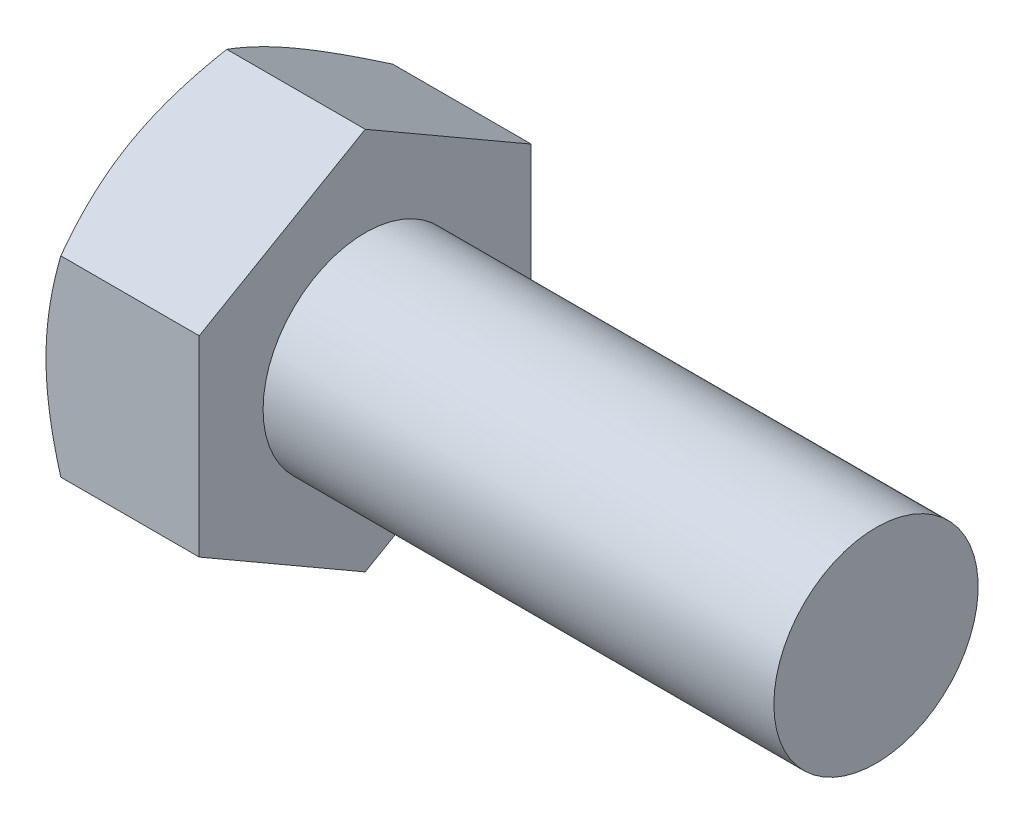
ISO-10303-21;
HEADER;
FILE_DESCRIPTION(('STEP AP214'),'2;1');
FILE_NAME('part.step','',(''),(''),'','','');
FILE_SCHEMA(('AUTOMOTIVE_DESIGN { 1 0 10303 214 1 1 1 1 }'));
ENDSEC;
DATA;
#1=APPLICATION_CONTEXT('core data for automotive mechanical design processes');
#2=APPLICATION_PROTOCOL_DEFINITION('international standard','automotive_design',2000,#1);
#3=PRODUCT_CONTEXT('',#1,'mechanical');
#4=PRODUCT('Part','Part','',(#3));
#5=PRODUCT_RELATED_PRODUCT_CATEGORY('part','',(#4));
#6=PRODUCT_DEFINITION_FORMATION('','',#4);
#7=PRODUCT_DEFINITION_CONTEXT('part definition',#1,'design');
#8=PRODUCT_DEFINITION('design','',#6,#7);
#9=PRODUCT_DEFINITION_SHAPE('','',#8);
#10=(LENGTH_UNIT() NAMED_UNIT(*) SI_UNIT(.MILLI.,.METRE.));
#11=(NAMED_UNIT(*) PLANE_ANGLE_UNIT() SI_UNIT($,.RADIAN.));
#12=(NAMED_UNIT(*) SI_UNIT($,.STERADIAN.) SOLID_ANGLE_UNIT());
#13=UNCERTAINTY_MEASURE_WITH_UNIT(LENGTH_MEASURE(1.E-05),#10,'distance_accuracy_value','');
#14=(GEOMETRIC_REPRESENTATION_CONTEXT(3) GLOBAL_UNCERTAINTY_ASSIGNED_CONTEXT((#13)) GLOBAL_UNIT_ASSIGNED_CONTEXT((#10,
#11,#12)) REPRESENTATION_CONTEXT('',''));
#15=CARTESIAN_POINT('',(0.,0.,0.));
#16=DIRECTION('',(0.,0.,1.));
#17=DIRECTION('',(1.,0.,0.));
#18=AXIS2_PLACEMENT_3D('',#15,#16,#17);
#19=CARTESIAN_POINT('',(6.,4.,0.));
#20=DIRECTION('',(-1.,0.,0.));
#21=DIRECTION('',(0.,0.,1.));
#22=AXIS2_PLACEMENT_3D('',#19,#20,#21);
#23=PLANE('',#22);
#24=CARTESIAN_POINT('',(6.,0.,0.));
#25=DIRECTION('',(-1.,0.,0.));
#26=DIRECTION('',(0.,0.,1.));
#27=AXIS2_PLACEMENT_3D('',#24,#25,#26);
#28=CIRCLE('',#27,4.);
#29=CARTESIAN_POINT('',(6.,0.,4.));
#30=VERTEX_POINT('',#29);
#31=EDGE_CURVE('E192',#30,#30,#28,.T.);
#32=ORIENTED_EDGE('',*,*,#31,.T.);
#33=EDGE_LOOP('',(#32));
#34=FACE_BOUND('',#33,.T.);
#35=DIRECTION('',(0.,1.,0.));
#36=VECTOR('',#35,1.);
#37=CARTESIAN_POINT('',(6.,-3.75277676613167,6.5));
#38=LINE('',#37,#36);
#39=CARTESIAN_POINT('',(6.,-3.75277676613167,6.5));
#40=VERTEX_POINT('',#39);
#41=CARTESIAN_POINT('',(6.,3.75277676613193,6.5));
#42=VERTEX_POINT('',#41);
#43=EDGE_CURVE('E56',#40,#42,#38,.T.);
#44=ORIENTED_EDGE('',*,*,#43,.F.);
#45=DIRECTION('',(0.,0.50000000163871,0.866025402838329));
#46=VECTOR('',#45,1.);
#47=CARTESIAN_POINT('',(6.,-7.50555353226347,0.));
#48=LINE('',#47,#46);
#49=CARTESIAN_POINT('',(6.,-7.50555353226347,0.));
#50=VERTEX_POINT('',#49);
#51=EDGE_CURVE('E129',#50,#40,#48,.T.);
#52=ORIENTED_EDGE('',*,*,#51,.F.);
#53=DIRECTION('',(0.,-0.50000000163871,0.866025402838329));
#54=VECTOR('',#53,1.);
#55=CARTESIAN_POINT('',(6.,-3.75277676613167,-6.5));
#56=LINE('',#55,#54);
#57=CARTESIAN_POINT('',(6.,-3.75277676613167,-6.5));
#58=VERTEX_POINT('',#57);
#59=EDGE_CURVE('E127',#58,#50,#56,.T.);
#60=ORIENTED_EDGE('',*,*,#59,.F.);
#61=DIRECTION('',(0.,-1.,0.));
#62=VECTOR('',#61,1.);
#63=CARTESIAN_POINT('',(6.,3.75277676613193,-6.5));
#64=LINE('',#63,#62);
#65=CARTESIAN_POINT('',(6.,3.75277676613193,-6.5));
#66=VERTEX_POINT('',#65);
#67=EDGE_CURVE('E110',#66,#58,#64,.T.);
#68=ORIENTED_EDGE('',*,*,#67,.F.);
#69=DIRECTION('',(0.,-0.50000000163871,-0.866025402838329));
#70=VECTOR('',#69,1.);
#71=CARTESIAN_POINT('',(6.,7.50555353226373,0.));
#72=LINE('',#71,#70);
#73=CARTESIAN_POINT('',(6.,7.50555353226373,0.));
#74=VERTEX_POINT('',#73);
#75=EDGE_CURVE('E119',#74,#66,#72,.T.);
#76=ORIENTED_EDGE('',*,*,#75,.F.);
#77=DIRECTION('',(0.,0.50000000163871,-0.866025402838329));
#78=VECTOR('',#77,1.);
#79=CARTESIAN_POINT('',(6.,3.75277676613193,6.5));
#80=LINE('',#79,#78);
#81=EDGE_CURVE('E123',#42,#74,#80,.T.);
#82=ORIENTED_EDGE('',*,*,#81,.F.);
#83=EDGE_LOOP('',(#44,#52,#60,#68,#76,#82));
#84=FACE_BOUND('',#83,.T.);
#85=ADVANCED_FACE('F33',(#34,#84),#23,.F.);
#86=CARTESIAN_POINT('',(-25.4,0.,0.));
#87=DIRECTION('',(-1.,0.,0.));
#88=DIRECTION('',(0.,0.,1.));
#89=AXIS2_PLACEMENT_3D('',#86,#87,#88);
#90=CYLINDRICAL_SURFACE('',#89,4.);
#91=CARTESIAN_POINT('',(26.,0.,0.));
#92=DIRECTION('',(-1.,0.,0.));
#93=DIRECTION('',(0.,0.,1.));
#94=AXIS2_PLACEMENT_3D('',#91,#92,#93);
#95=CIRCLE('',#94,4.);
#96=CARTESIAN_POINT('',(26.,0.,4.));
#97=VERTEX_POINT('',#96);
#98=EDGE_CURVE('E11',#97,#97,#95,.T.);
#99=ORIENTED_EDGE('',*,*,#98,.T.);
#100=EDGE_LOOP('',(#99));
#101=FACE_BOUND('',#100,.T.);
#102=ORIENTED_EDGE('',*,*,#31,.F.);
#103=EDGE_LOOP('',(#102));
#104=FACE_BOUND('',#103,.T.);
#105=ADVANCED_FACE('F35',(#101,#104),#90,.T.);
#106=CARTESIAN_POINT('',(26.,4.,0.));
#107=DIRECTION('',(1.,0.,0.));
#108=DIRECTION('',(0.,0.,-1.));
#109=AXIS2_PLACEMENT_3D('',#106,#107,#108);
#110=PLANE('',#109);
#111=ORIENTED_EDGE('',*,*,#98,.F.);
#112=EDGE_LOOP('',(#111));
#113=FACE_BOUND('',#112,.T.);
#114=ADVANCED_FACE('F175',(#113),#110,.T.);
#115=CARTESIAN_POINT('',(6.,-3.75277676613167,6.5));
#116=DIRECTION('',(0.,0.,1.));
#117=DIRECTION('',(0.,-1.,0.));
#118=AXIS2_PLACEMENT_3D('',#115,#116,#117);
#119=PLANE('',#118);
#120=DIRECTION('',(-1.,0.,0.));
#121=VECTOR('',#120,1.);
#122=CARTESIAN_POINT('',(6.,-3.75277676613167,6.5));
#123=LINE('',#122,#121);
#124=CARTESIAN_POINT('',(0.58055658833478,-3.75277676613167,6.5));
#125=VERTEX_POINT('',#124);
#126=EDGE_CURVE('E136',#40,#125,#123,.T.);
#127=ORIENTED_EDGE('',*,*,#126,.F.);
#128=ORIENTED_EDGE('',*,*,#43,.T.);
#129=DIRECTION('',(-1.,0.,0.));
#130=VECTOR('',#129,1.);
#131=CARTESIAN_POINT('',(6.,3.75277676613193,6.5));
#132=LINE('',#131,#130);
#133=CARTESIAN_POINT('',(0.580556588334851,3.75277676613193,6.5));
#134=VERTEX_POINT('',#133);
#135=EDGE_CURVE('E135',#42,#134,#132,.T.);
#136=ORIENTED_EDGE('',*,*,#135,.T.);
#137=CARTESIAN_POINT('',(3.11043211457154,-9.95293462980581,6.50000000000001));
#138=CARTESIAN_POINT('',(2.97251732999809,-9.66754773691578,6.50000000000001));
#139=CARTESIAN_POINT('',(2.83597352767406,-9.38148609518816,6.50000000000001));
#140=CARTESIAN_POINT('',(2.5664113122552,-8.8076484828279,6.50000000000001));
#141=CARTESIAN_POINT('',(2.43339350953817,-8.5198722258065,6.50000000000001));
#142=CARTESIAN_POINT('',(2.17096597683625,-7.94068601624757,6.50000000000001));
#143=CARTESIAN_POINT('',(2.04158125030937,-7.64926469367666,6.50000000000001));
#144=CARTESIAN_POINT('',(1.78836916374544,-7.0640268116551,6.50000000000001));
#145=CARTESIAN_POINT('',(1.66454151402989,-6.77021037800212,6.5));
#146=CARTESIAN_POINT('',(1.42245115301837,-6.17606746350322,6.5));
#147=CARTESIAN_POINT('',(1.30427542788582,-5.87570534433512,6.5));
#148=CARTESIAN_POINT('',(1.07717949532839,-5.27143808598076,6.5));
#149=CARTESIAN_POINT('',(0.968260317643808,-4.9675325568748,6.5));
#150=CARTESIAN_POINT('',(0.762603792727739,-4.35632024518572,6.5));
#151=CARTESIAN_POINT('',(0.665840547140617,-4.04902226498118,6.5));
#152=CARTESIAN_POINT('',(0.487639558111468,-3.43005447940302,6.5));
#153=CARTESIAN_POINT('',(0.406196968217358,-3.11838609017719,6.5));
#154=CARTESIAN_POINT('',(0.262586910330177,-2.49047963102143,6.5));
#155=CARTESIAN_POINT('',(0.20042457364863,-2.17424036798122,6.5));
#156=CARTESIAN_POINT('',(0.0995759642672016,-1.537904769998,6.5));
#157=CARTESIAN_POINT('',(0.0608897123036703,-1.2178084316483,6.5));
#158=CARTESIAN_POINT('',(0.0229473783649619,-0.737154518749689,6.5));
#159=CARTESIAN_POINT('',(0.013645849686351,-0.57734933768936,6.5));
#160=CARTESIAN_POINT('',(0.00181436633371468,-0.257481140078616,6.5));
#161=CARTESIAN_POINT('',(-0.000715676279636632,-0.0974181269036041,6.5));
#162=CARTESIAN_POINT('',(0.0010637749184029,0.222623553129327,6.5));
#163=CARTESIAN_POINT('',(0.0053713492112469,0.382602231051606,6.5));
#164=CARTESIAN_POINT('',(0.0207168655482215,0.702239110118842,6.5));
#165=CARTESIAN_POINT('',(0.031755143704846,0.861897294859769,6.5));
#166=CARTESIAN_POINT('',(0.0664356036466686,1.24885887263938,6.5));
#167=CARTESIAN_POINT('',(0.0934503430170371,1.47586490340122,6.5));
#168=CARTESIAN_POINT('',(0.159587791113396,1.92813751213394,6.5));
#169=CARTESIAN_POINT('',(0.198713804679522,2.15340359810335,6.5));
#170=CARTESIAN_POINT('',(0.287686193091544,2.60201039278951,6.5));
#171=CARTESIAN_POINT('',(0.337542704062777,2.825349071948,6.5));
#172=CARTESIAN_POINT('',(0.446454887278145,3.2697286025728,6.5));
#173=CARTESIAN_POINT('',(0.505509692919176,3.49076966841461,6.5));
#174=CARTESIAN_POINT('',(0.632949342579848,3.93599818375451,6.5));
#175=CARTESIAN_POINT('',(0.701527403962431,4.16012994530375,6.5));
#176=CARTESIAN_POINT('',(0.84545947294631,4.60602439071534,6.5));
#177=CARTESIAN_POINT('',(0.920808806920038,4.82778859220543,6.5));
#178=CARTESIAN_POINT('',(1.07672700383232,5.26805805858343,6.5));
#179=CARTESIAN_POINT('',(1.15726410060785,5.48657464102607,6.5));
#180=CARTESIAN_POINT('',(1.32306538737704,5.92191241707277,6.5));
#181=CARTESIAN_POINT('',(1.40833148788562,6.13873288448509,6.49999999999999));
#182=CARTESIAN_POINT('',(1.49549428820606,6.35476566546686,6.5));
#183=B_SPLINE_CURVE_WITH_KNOTS('',3,(#137,#138,#139,#140,#141,#142,#143,#144,#145,#146,#147,
#148,#149,#150,#151,#152,#153,#154,#155,#156,#157,#158,#159,#160,#161,#162,#163,#164,#165,#166,
#167,#168,#169,#170,#171,#172,#173,#174,#175,#176,#177,#178,#179,#180,#181,#182),.UNSPECIFIED.,
.F.,.F.,(4,2,2,2,2,2,2,2,2,2,2,2,2,2,2,2,2,2,2,2,2,2,4),(0.,0.950904716264931,1.9019729805082,
2.85848379350738,3.81494468759527,4.78314822163398,5.75145932241847,6.71767111714935,
7.68357674987525,8.64973923182812,9.61590256718796,10.0960076379283,10.576106473653,
11.0560705554624,11.5360586072965,12.2215002259562,12.907129048276,13.5934083867621,
14.2796231075672,14.9826585200403,15.6852123608422,16.3838117642958,17.0826954870462),.UNSPECIFIED.);
#184=CARTESIAN_POINT('',(0.,0.,6.5));
#185=VERTEX_POINT('',#184);
#186=EDGE_CURVE('E177',#185,#134,#183,.T.);
#187=ORIENTED_EDGE('',*,*,#186,.F.);
#188=EDGE_CURVE('E184',#125,#185,#183,.T.);
#189=ORIENTED_EDGE('',*,*,#188,.F.);
#190=EDGE_LOOP('',(#127,#128,#136,#187,#189));
#191=FACE_BOUND('',#190,.T.);
#192=ADVANCED_FACE('F171',(#191),#119,.T.);
#193=CARTESIAN_POINT('',(6.,-7.50555353226347,0.));
#194=DIRECTION('',(0.,-0.866025402838329,0.50000000163871));
#195=DIRECTION('',(0.,-0.50000000163871,-0.866025402838329));
#196=AXIS2_PLACEMENT_3D('',#193,#194,#195);
#197=PLANE('',#196);
#198=DIRECTION('',(-1.,0.,0.));
#199=VECTOR('',#198,1.);
#200=CARTESIAN_POINT('',(6.,-7.50555353226347,0.));
#201=LINE('',#200,#199);
#202=CARTESIAN_POINT('',(0.580556602536895,-7.50555353226347,0.));
#203=VERTEX_POINT('',#202);
#204=EDGE_CURVE('E140',#50,#203,#201,.T.);
#205=ORIENTED_EDGE('',*,*,#204,.F.);
#206=ORIENTED_EDGE('',*,*,#51,.T.);
#207=ORIENTED_EDGE('',*,*,#126,.T.);
#208=CARTESIAN_POINT('',(0.580623270742291,-7.50566900231782,-0.000200000000003144));
#209=CARTESIAN_POINT('',(0.53300444166228,-7.42317866226328,0.142677459483733));
#210=CARTESIAN_POINT('',(0.487546718842011,-7.34038075823957,0.286087635386321));
#211=CARTESIAN_POINT('',(0.401548699574278,-7.17411254160279,0.574072633026627));
#212=CARTESIAN_POINT('',(0.361010524438677,-7.09064195535582,0.718647928712167));
#213=CARTESIAN_POINT('',(0.247571017323861,-6.83889372414902,1.15468865397249));
#214=CARTESIAN_POINT('',(0.183047822675309,-6.66962234179952,1.44787528718805));
#215=CARTESIAN_POINT('',(0.107386598181381,-6.41631079686878,1.88662375123456));
#216=CARTESIAN_POINT('',(0.0858328708013485,-6.33302750552642,2.03087464263073));
#217=CARTESIAN_POINT('',(0.0496903283969648,-6.16608460665533,2.32002822417472));
#218=CARTESIAN_POINT('',(0.0351008979865214,-6.0824250330357,2.46493085559027));
#219=CARTESIAN_POINT('',(0.0132587655384519,-5.91496058439093,2.75498778783701));
#220=CARTESIAN_POINT('',(0.00599773712138261,-5.83115598288129,2.90014161492545));
#221=CARTESIAN_POINT('',(-0.0010396850441314,-5.66347398888092,3.19057534677938));
#222=CARTESIAN_POINT('',(-0.000816310007976246,-5.5795965987189,3.33585524751143));
#223=CARTESIAN_POINT('',(0.0100834701737952,-5.34979923670108,3.73387595223228));
#224=CARTESIAN_POINT('',(0.0283818290848654,-5.20395448568658,3.98648646990276));
#225=CARTESIAN_POINT('',(0.0864063516439952,-4.91323367346421,4.49002968528916));
#226=CARTESIAN_POINT('',(0.126152348138138,-4.76835863469146,4.74096061209552));
#227=CARTESIAN_POINT('',(0.225505911524682,-4.47705273713176,5.24551722500853));
#228=CARTESIAN_POINT('',(0.285534433264533,-4.33065863605464,5.49907924489444));
#229=CARTESIAN_POINT('',(0.421774998706141,-4.04005359573947,6.00242193745635));
#230=CARTESIAN_POINT('',(0.497955039626379,-3.89583893475022,6.25220905639452));
#231=CARTESIAN_POINT('',(0.58062325653952,-3.75266129607733,6.5002));
#232=B_SPLINE_CURVE_WITH_KNOTS('',3,(#208,#209,#210,#211,#212,#213,#214,#215,#216,#217,#218,
#219,#220,#221,#222,#223,#224,#225,#226,#227,#228,#229,#230,#231),.UNSPECIFIED.,.F.,.F.,(4,2,2,
2,2,2,2,2,2,2,2,4),(0.,0.515105054619943,1.03043143952497,2.06322555717465,2.56697390659617,
3.07067773506457,3.57380861916821,4.07692396008232,4.9527935623796,5.82947448150744,
6.72559913491943,7.61996452012188),.UNSPECIFIED.);
#233=CARTESIAN_POINT('',(0.,-5.62916513689818,3.25000002130317));
#234=VERTEX_POINT('',#233);
#235=EDGE_CURVE('E186',#234,#125,#232,.T.);
#236=ORIENTED_EDGE('',*,*,#235,.F.);
#237=EDGE_CURVE('E185',#203,#234,#232,.T.);
#238=ORIENTED_EDGE('',*,*,#237,.F.);
#239=EDGE_LOOP('',(#205,#206,#207,#236,#238));
#240=FACE_BOUND('',#239,.T.);
#241=ADVANCED_FACE('F174',(#240),#197,.T.);
#242=CARTESIAN_POINT('',(6.,-3.75277676613167,-6.5));
#243=DIRECTION('',(0.,-0.866025402838329,-0.50000000163871));
#244=DIRECTION('',(0.,0.50000000163871,-0.866025402838329));
#245=AXIS2_PLACEMENT_3D('',#242,#243,#244);
#246=PLANE('',#245);
#247=DIRECTION('',(-1.,0.,0.));
#248=VECTOR('',#247,1.);
#249=CARTESIAN_POINT('',(6.,-3.75277676613167,-6.5));
#250=LINE('',#249,#248);
#251=CARTESIAN_POINT('',(0.58055658833478,-3.75277676613167,-6.5));
#252=VERTEX_POINT('',#251);
#253=EDGE_CURVE('E116',#58,#252,#250,.T.);
#254=ORIENTED_EDGE('',*,*,#253,.F.);
#255=ORIENTED_EDGE('',*,*,#59,.T.);
#256=ORIENTED_EDGE('',*,*,#204,.T.);
#257=CARTESIAN_POINT('',(0.58062325653952,-3.75266129607733,-6.5002));
#258=CARTESIAN_POINT('',(0.533004428042512,-3.83515163593272,-6.35732254086121));
#259=CARTESIAN_POINT('',(0.487546705819869,-3.91794953975631,-6.21391236530523));
#260=CARTESIAN_POINT('',(0.401548687774518,-4.08421775598869,-5.92592736836536));
#261=CARTESIAN_POINT('',(0.361010513263684,-4.16768834203138,-5.78135207303365));
#262=CARTESIAN_POINT('',(0.247571008067886,-4.41943657260328,-5.34531134887302));
#263=CARTESIAN_POINT('',(0.183047814748916,-4.58870795451263,-5.05212471641982));
#264=CARTESIAN_POINT('',(0.107386592246521,-4.84201949876275,-4.61337625355216));
#265=CARTESIAN_POINT('',(0.0858328655208273,-4.92530278988289,-4.46912536254089));
#266=CARTESIAN_POINT('',(0.0496903244176305,-5.09224568829665,-4.17997178178902));
#267=CARTESIAN_POINT('',(0.0351008946540422,-5.17590526168117,-4.03506915078069));
#268=CARTESIAN_POINT('',(0.0132587634756931,-5.34336970984364,-3.74501221936934));
#269=CARTESIAN_POINT('',(0.00599773568166414,-5.42717431110609,-3.59985839270903));
#270=CARTESIAN_POINT('',(-0.00103968527713145,-5.59485630459851,-3.30942466173489));
#271=CARTESIAN_POINT('',(-0.000816309657284269,-5.67873369449977,-3.1641447614545));
#272=CARTESIAN_POINT('',(0.0100834720961694,-5.90853105676406,-2.76612405630674));
#273=CARTESIAN_POINT('',(0.0283818320924434,-6.05437580827188,-2.51351353778183));
#274=CARTESIAN_POINT('',(0.0864063568768331,-6.34509662144107,-2.00997032075547));
#275=CARTESIAN_POINT('',(0.126152354511259,-6.4899716606673,-1.75903939316366));
#276=CARTESIAN_POINT('',(0.225505920188921,-6.78127755912479,-1.25448277869563));
#277=CARTESIAN_POINT('',(0.285534443080783,-6.9276716606454,-1.00092075804159));
#278=CARTESIAN_POINT('',(0.421775010768133,-7.21827670182223,-0.497578063987228));
#279=CARTESIAN_POINT('',(0.497955052781648,-7.36249136322977,-0.247790944324558));
#280=CARTESIAN_POINT('',(0.58062327074229,-7.50566900231782,0.000199999999997322));
#281=B_SPLINE_CURVE_WITH_KNOTS('',3,(#257,#258,#259,#260,#261,#262,#263,#264,#265,#266,#267,
#268,#269,#270,#271,#272,#273,#274,#275,#276,#277,#278,#279,#280),.UNSPECIFIED.,.F.,.F.,(4,2,2,
2,2,2,2,2,2,2,2,4),(0.,0.515105052986577,1.03043143625733,2.06322555055849,2.56697389840574,
3.07067772530045,3.57380860784244,4.0769239471958,4.95279355264481,5.82947447493454,
6.72559913165139,7.61996452012142),.UNSPECIFIED.);
#282=CARTESIAN_POINT('',(0.,-5.62916513689818,-3.25000002130317));
#283=VERTEX_POINT('',#282);
#284=EDGE_CURVE('E215',#283,#203,#281,.T.);
#285=ORIENTED_EDGE('',*,*,#284,.F.);
#286=EDGE_CURVE('E220',#252,#283,#281,.T.);
#287=ORIENTED_EDGE('',*,*,#286,.F.);
#288=EDGE_LOOP('',(#254,#255,#256,#285,#287));
#289=FACE_BOUND('',#288,.T.);
#290=ADVANCED_FACE('F289',(#289),#246,.T.);
#291=CARTESIAN_POINT('',(6.,3.75277676613193,-6.5));
#292=DIRECTION('',(0.,0.,-1.));
#293=DIRECTION('',(-1.,0.,0.));
#294=AXIS2_PLACEMENT_3D('',#291,#292,#293);
#295=PLANE('',#294);
#296=DIRECTION('',(-1.,0.,0.));
#297=VECTOR('',#296,1.);
#298=CARTESIAN_POINT('',(6.,3.75277676613193,-6.5));
#299=LINE('',#298,#297);
#300=CARTESIAN_POINT('',(0.580556588334854,3.75277676613193,-6.5));
#301=VERTEX_POINT('',#300);
#302=EDGE_CURVE('E105',#66,#301,#299,.T.);
#303=ORIENTED_EDGE('',*,*,#302,.F.);
#304=ORIENTED_EDGE('',*,*,#67,.T.);
#305=ORIENTED_EDGE('',*,*,#253,.T.);
#306=CARTESIAN_POINT('',(3.11043211457154,-9.95293462980581,-6.5));
#307=CARTESIAN_POINT('',(2.97251732999809,-9.66754773691578,-6.5));
#308=CARTESIAN_POINT('',(2.83597352767406,-9.38148609518816,-6.5));
#309=CARTESIAN_POINT('',(2.5664113122552,-8.8076484828279,-6.5));
#310=CARTESIAN_POINT('',(2.43339350953817,-8.5198722258065,-6.5));
#311=CARTESIAN_POINT('',(2.17096597683625,-7.94068601624757,-6.5));
#312=CARTESIAN_POINT('',(2.04158125030937,-7.64926469367666,-6.5));
#313=CARTESIAN_POINT('',(1.78836916374544,-7.06402681165511,-6.5));
#314=CARTESIAN_POINT('',(1.66454151402989,-6.77021037800212,-6.5));
#315=CARTESIAN_POINT('',(1.42245115301837,-6.17606746350322,-6.5));
#316=CARTESIAN_POINT('',(1.30427542788582,-5.87570534433512,-6.5));
#317=CARTESIAN_POINT('',(1.07717949532839,-5.27143808598076,-6.5));
#318=CARTESIAN_POINT('',(0.968260317643808,-4.9675325568748,-6.5));
#319=CARTESIAN_POINT('',(0.762603792727739,-4.35632024518572,-6.5));
#320=CARTESIAN_POINT('',(0.665840547140618,-4.04902226498118,-6.5));
#321=CARTESIAN_POINT('',(0.487639558111469,-3.43005447940302,-6.5));
#322=CARTESIAN_POINT('',(0.406196968217358,-3.11838609017719,-6.5));
#323=CARTESIAN_POINT('',(0.262586910330178,-2.49047963102143,-6.5));
#324=CARTESIAN_POINT('',(0.200424573648631,-2.17424036798122,-6.5));
#325=CARTESIAN_POINT('',(0.0995759642672023,-1.537904769998,-6.5));
#326=CARTESIAN_POINT('',(0.0608897123036705,-1.2178084316483,-6.5));
#327=CARTESIAN_POINT('',(0.0229473783649626,-0.737154518749687,-6.5));
#328=CARTESIAN_POINT('',(0.0136458496863522,-0.577349337689358,-6.5));
#329=CARTESIAN_POINT('',(0.00181436633371622,-0.257481140078615,-6.5));
#330=CARTESIAN_POINT('',(-0.000715676279635139,-0.097418126903603,-6.5));
#331=CARTESIAN_POINT('',(0.00106377491840446,0.222623553129327,-6.5));
#332=CARTESIAN_POINT('',(0.00537134921124859,0.382602231051605,-6.5));
#333=CARTESIAN_POINT('',(0.0207168655482233,0.702239110118842,-6.5));
#334=CARTESIAN_POINT('',(0.0317551437048478,0.861897294859769,-6.5));
#335=CARTESIAN_POINT('',(0.0664356036466706,1.24885887263938,-6.5));
#336=CARTESIAN_POINT('',(0.0934503430170392,1.47586490340122,-6.5));
#337=CARTESIAN_POINT('',(0.159587791113398,1.92813751213394,-6.5));
#338=CARTESIAN_POINT('',(0.198713804679524,2.15340359810335,-6.5));
#339=CARTESIAN_POINT('',(0.287686193091546,2.60201039278951,-6.5));
#340=CARTESIAN_POINT('',(0.33754270406278,2.825349071948,-6.5));
#341=CARTESIAN_POINT('',(0.446454887278149,3.26972860257281,-6.5));
#342=CARTESIAN_POINT('',(0.505509692919179,3.49076966841461,-6.5));
#343=CARTESIAN_POINT('',(0.632949342579851,3.93599818375451,-6.5));
#344=CARTESIAN_POINT('',(0.701527403962434,4.16012994530375,-6.5));
#345=CARTESIAN_POINT('',(0.845459472946313,4.60602439071534,-6.5));
#346=CARTESIAN_POINT('',(0.920808806920041,4.82778859220543,-6.5));
#347=CARTESIAN_POINT('',(1.07672700383232,5.26805805858343,-6.5));
#348=CARTESIAN_POINT('',(1.15726410060785,5.48657464102608,-6.5));
#349=CARTESIAN_POINT('',(1.32306538737704,5.92191241707277,-6.5));
#350=CARTESIAN_POINT('',(1.40833148788562,6.1387328844851,-6.5));
#351=CARTESIAN_POINT('',(1.49549428820607,6.35476566546687,-6.5));
#352=B_SPLINE_CURVE_WITH_KNOTS('',3,(#306,#307,#308,#309,#310,#311,#312,#313,#314,#315,#316,
#317,#318,#319,#320,#321,#322,#323,#324,#325,#326,#327,#328,#329,#330,#331,#332,#333,#334,#335,
#336,#337,#338,#339,#340,#341,#342,#343,#344,#345,#346,#347,#348,#349,#350,#351),.UNSPECIFIED.,
.F.,.F.,(4,2,2,2,2,2,2,2,2,2,2,2,2,2,2,2,2,2,2,2,2,2,4),(0.,0.950904716264929,1.9019729805082,
2.85848379350738,3.81494468759527,4.78314822163398,5.75145932241847,6.71767111714935,
7.68357674987525,8.64973923182813,9.61590256718796,10.0960076379283,10.576106473653,
11.0560705554624,11.5360586072965,12.2215002259562,12.907129048276,13.5934083867621,
14.2796231075672,14.9826585200403,15.6852123608422,16.3838117642958,17.0826954870462),.UNSPECIFIED.);
#353=CARTESIAN_POINT('',(0.,0.,-6.5));
#354=VERTEX_POINT('',#353);
#355=EDGE_CURVE('E216',#354,#252,#352,.F.);
#356=ORIENTED_EDGE('',*,*,#355,.F.);
#357=EDGE_CURVE('E113',#301,#354,#352,.F.);
#358=ORIENTED_EDGE('',*,*,#357,.F.);
#359=EDGE_LOOP('',(#303,#304,#305,#356,#358));
#360=FACE_BOUND('',#359,.T.);
#361=ADVANCED_FACE('F107',(#360),#295,.T.);
#362=CARTESIAN_POINT('',(6.,7.50555353226373,0.));
#363=DIRECTION('',(0.,0.866025402838329,-0.50000000163871));
#364=DIRECTION('',(0.,0.50000000163871,0.866025402838329));
#365=AXIS2_PLACEMENT_3D('',#362,#363,#364);
#366=PLANE('',#365);
#367=DIRECTION('',(-1.,0.,0.));
#368=VECTOR('',#367,1.);
#369=CARTESIAN_POINT('',(6.,7.50555353226373,0.));
#370=LINE('',#369,#368);
#371=CARTESIAN_POINT('',(0.580556602537043,7.50555353226373,0.));
#372=VERTEX_POINT('',#371);
#373=EDGE_CURVE('E48',#74,#372,#370,.T.);
#374=ORIENTED_EDGE('',*,*,#373,.F.);
#375=ORIENTED_EDGE('',*,*,#75,.T.);
#376=ORIENTED_EDGE('',*,*,#302,.T.);
#377=CARTESIAN_POINT('',(0.580623270742439,7.50566900231807,0.000199999999997118));
#378=CARTESIAN_POINT('',(0.533004441662427,7.42317866226353,-0.142677459483743));
#379=CARTESIAN_POINT('',(0.487546718842157,7.34038075823982,-0.286087635386337));
#380=CARTESIAN_POINT('',(0.40154869957442,7.17411254160304,-0.574072633026652));
#381=CARTESIAN_POINT('',(0.361010524438818,7.09064195535606,-0.718647928712197));
#382=CARTESIAN_POINT('',(0.247571017323998,6.83889372414925,-1.15468865397253));
#383=CARTESIAN_POINT('',(0.183047822675445,6.66962234179975,-1.4478752871881));
#384=CARTESIAN_POINT('',(0.107386598181514,6.416310796869,-1.88662375123463));
#385=CARTESIAN_POINT('',(0.0858328708014802,6.33302750552664,-2.0308746426308));
#386=CARTESIAN_POINT('',(0.0496903283970952,6.16608460665554,-2.32002822417481));
#387=CARTESIAN_POINT('',(0.0351008979866518,6.08242503303591,-2.46493085559036));
#388=CARTESIAN_POINT('',(0.0132587655385817,5.91496058439113,-2.75498778783711));
#389=CARTESIAN_POINT('',(0.00599773712151171,5.83115598288149,-2.90014161492555));
#390=CARTESIAN_POINT('',(-0.00103968504400261,5.66347398888112,-3.19057534677949));
#391=CARTESIAN_POINT('',(-0.000816310007847093,5.57959659871909,-3.33585524751155));
#392=CARTESIAN_POINT('',(0.0100834701739246,5.34979923670127,-3.7338759522324));
#393=CARTESIAN_POINT('',(0.0283818290849928,5.20395448568677,-3.98648646990286));
#394=CARTESIAN_POINT('',(0.0864063516441167,4.91323367346442,-4.49002968528924));
#395=CARTESIAN_POINT('',(0.126152348138256,4.76835863469168,-4.74096061209559));
#396=CARTESIAN_POINT('',(0.22550591152479,4.47705273713198,-5.24551722500858));
#397=CARTESIAN_POINT('',(0.285534433264634,4.33065863605487,-5.49907924489448));
#398=CARTESIAN_POINT('',(0.42177499870623,4.04005359573972,-6.00242193745636));
#399=CARTESIAN_POINT('',(0.49795503962646,3.89583893475047,-6.25220905639453));
#400=CARTESIAN_POINT('',(0.580623256539594,3.75266129607759,-6.5002));
#401=B_SPLINE_CURVE_WITH_KNOTS('',3,(#377,#378,#379,#380,#381,#382,#383,#384,#385,#386,#387,
#388,#389,#390,#391,#392,#393,#394,#395,#396,#397,#398,#399,#400),.UNSPECIFIED.,.F.,.F.,(4,2,2,
2,2,2,2,2,2,2,2,4),(0.,0.515105054619961,1.030431439525,2.06322555717472,2.56697390659626,
3.07067773506467,3.57380861916833,4.07692396008246,4.9527935623797,5.82947448150751,
6.72559913491946,7.61996452012187),.UNSPECIFIED.);
#402=CARTESIAN_POINT('',(0.,5.62916513689837,-3.25000002130329));
#403=VERTEX_POINT('',#402);
#404=EDGE_CURVE('E154',#403,#301,#401,.T.);
#405=ORIENTED_EDGE('',*,*,#404,.F.);
#406=EDGE_CURVE('E279',#372,#403,#401,.T.);
#407=ORIENTED_EDGE('',*,*,#406,.F.);
#408=EDGE_LOOP('',(#374,#375,#376,#405,#407));
#409=FACE_BOUND('',#408,.T.);
#410=ADVANCED_FACE('F120',(#409),#366,.T.);
#411=CARTESIAN_POINT('',(6.,3.75277676613193,6.5));
#412=DIRECTION('',(0.,0.866025402838329,0.50000000163871));
#413=DIRECTION('',(0.,-0.50000000163871,0.866025402838329));
#414=AXIS2_PLACEMENT_3D('',#411,#412,#413);
#415=PLANE('',#414);
#416=ORIENTED_EDGE('',*,*,#135,.F.);
#417=ORIENTED_EDGE('',*,*,#81,.T.);
#418=ORIENTED_EDGE('',*,*,#373,.T.);
#419=CARTESIAN_POINT('',(0.580623256539591,3.75266129607759,6.5002));
#420=CARTESIAN_POINT('',(0.533004428042585,3.83515163593297,6.3573225408612));
#421=CARTESIAN_POINT('',(0.487546705819944,3.91794953975657,6.21391236530522));
#422=CARTESIAN_POINT('',(0.401548687774596,4.08421775598896,5.92592736836534));
#423=CARTESIAN_POINT('',(0.361010513263764,4.16768834203165,5.78135207303363));
#424=CARTESIAN_POINT('',(0.247571008067972,4.41943657260355,5.34531134887299));
#425=CARTESIAN_POINT('',(0.183047814749007,4.5887079545129,5.05212471641978));
#426=CARTESIAN_POINT('',(0.10738659224662,4.84201949876303,4.61337625355212));
#427=CARTESIAN_POINT('',(0.0858328655209291,4.92530278988317,4.46912536254085));
#428=CARTESIAN_POINT('',(0.0496903244177381,5.09224568829693,4.17997178178897));
#429=CARTESIAN_POINT('',(0.0351008946541527,5.17590526168146,4.03506915078064));
#430=CARTESIAN_POINT('',(0.0132587634758095,5.34336970984392,3.74501221936928));
#431=CARTESIAN_POINT('',(0.00599773568178349,5.42717431110638,3.59985839270897));
#432=CARTESIAN_POINT('',(-0.00103968527700617,5.5948563045988,3.30942466173483));
#433=CARTESIAN_POINT('',(-0.000816309657156098,5.67873369450006,3.16414476145443));
#434=CARTESIAN_POINT('',(0.0100834720963056,5.90853105676436,2.76612405630667));
#435=CARTESIAN_POINT('',(0.0283818320925841,6.05437580827217,2.51351353778177));
#436=CARTESIAN_POINT('',(0.0864063568769807,6.34509662144136,2.00997032075542));
#437=CARTESIAN_POINT('',(0.126152354511409,6.48997166066758,1.75903939316362));
#438=CARTESIAN_POINT('',(0.225505920189073,6.78127755912507,1.2544827786956));
#439=CARTESIAN_POINT('',(0.285534443080935,6.92767166064567,1.00092075804156));
#440=CARTESIAN_POINT('',(0.421775010768284,7.21827670182249,0.497578063987211));
#441=CARTESIAN_POINT('',(0.497955052781797,7.36249136323003,0.247790944324547));
#442=CARTESIAN_POINT('',(0.580623270742438,7.50566900231807,-0.000200000000003151));
#443=B_SPLINE_CURVE_WITH_KNOTS('',3,(#419,#420,#421,#422,#423,#424,#425,#426,#427,#428,#429,
#430,#431,#432,#433,#434,#435,#436,#437,#438,#439,#440,#441,#442),.UNSPECIFIED.,.F.,.F.,(4,2,2,
2,2,2,2,2,2,2,2,4),(0.,0.515105052986584,1.03043143625735,2.06322555055853,2.56697389840578,
3.0706777253005,3.5738086078425,4.07692394719587,4.95279355264486,5.82947447493458,
6.7255991316514,7.61996452012142),.UNSPECIFIED.);
#444=CARTESIAN_POINT('',(0.,5.62916513689837,3.25000002130328));
#445=VERTEX_POINT('',#444);
#446=EDGE_CURVE('E139',#445,#372,#443,.T.);
#447=ORIENTED_EDGE('',*,*,#446,.F.);
#448=EDGE_CURVE('E153',#134,#445,#443,.T.);
#449=ORIENTED_EDGE('',*,*,#448,.F.);
#450=EDGE_LOOP('',(#416,#417,#418,#447,#449));
#451=FACE_BOUND('',#450,.T.);
#452=ADVANCED_FACE('F164',(#451),#415,.T.);
#453=CARTESIAN_POINT('',(0.,0.,0.));
#454=DIRECTION('',(1.,0.,0.));
#455=DIRECTION('',(0.,0.,-1.));
#456=AXIS2_PLACEMENT_3D('',#453,#454,#455);
#457=CONICAL_SURFACE('',#456,6.5,1.0471975511966);
#458=CARTESIAN_POINT('',(0.,0.,0.));
#459=DIRECTION('',(-1.,0.,0.));
#460=DIRECTION('',(0.,0.,1.));
#461=AXIS2_PLACEMENT_3D('',#458,#459,#460);
#462=CIRCLE('',#461,6.5);
#463=EDGE_CURVE('E194',#234,#185,#462,.T.);
#464=ORIENTED_EDGE('',*,*,#463,.F.);
#465=ORIENTED_EDGE('',*,*,#235,.T.);
#466=ORIENTED_EDGE('',*,*,#188,.T.);
#467=EDGE_LOOP('',(#464,#465,#466));
#468=FACE_BOUND('',#467,.T.);
#469=ADVANCED_FACE('F168',(#468),#457,.T.);
#470=EDGE_CURVE('E202',#283,#234,#462,.T.);
#471=ORIENTED_EDGE('',*,*,#470,.F.);
#472=ORIENTED_EDGE('',*,*,#284,.T.);
#473=ORIENTED_EDGE('',*,*,#237,.T.);
#474=EDGE_LOOP('',(#471,#472,#473));
#475=FACE_BOUND('',#474,.T.);
#476=ADVANCED_FACE('F225',(#475),#457,.T.);
#477=ORIENTED_EDGE('',*,*,#355,.T.);
#478=ORIENTED_EDGE('',*,*,#286,.T.);
#479=EDGE_CURVE('E205',#354,#283,#462,.T.);
#480=ORIENTED_EDGE('',*,*,#479,.F.);
#481=EDGE_LOOP('',(#477,#478,#480));
#482=FACE_BOUND('',#481,.T.);
#483=ADVANCED_FACE('F160',(#482),#457,.T.);
#484=ORIENTED_EDGE('',*,*,#404,.T.);
#485=ORIENTED_EDGE('',*,*,#357,.T.);
#486=EDGE_CURVE('E201',#403,#354,#462,.T.);
#487=ORIENTED_EDGE('',*,*,#486,.F.);
#488=EDGE_LOOP('',(#484,#485,#487));
#489=FACE_BOUND('',#488,.T.);
#490=ADVANCED_FACE('F214',(#489),#457,.T.);
#491=EDGE_CURVE('E41',#185,#445,#462,.T.);
#492=ORIENTED_EDGE('',*,*,#491,.F.);
#493=ORIENTED_EDGE('',*,*,#186,.T.);
#494=ORIENTED_EDGE('',*,*,#448,.T.);
#495=EDGE_LOOP('',(#492,#493,#494));
#496=FACE_BOUND('',#495,.T.);
#497=ADVANCED_FACE('F253',(#496),#457,.T.);
#498=CARTESIAN_POINT('',(0.,0.,0.));
#499=DIRECTION('',(-1.,0.,0.));
#500=DIRECTION('',(0.,0.,1.));
#501=AXIS2_PLACEMENT_3D('',#498,#499,#500);
#502=PLANE('',#501);
#503=CARTESIAN_POINT('',(0.,0.,0.));
#504=DIRECTION('',(1.,0.,0.));
#505=DIRECTION('',(0.,0.,-1.));
#506=AXIS2_PLACEMENT_3D('',#503,#504,#505);
#507=CIRCLE('',#506,5.6875);
#508=CARTESIAN_POINT('',(0.,0.,-5.6875));
#509=VERTEX_POINT('',#508);
#510=EDGE_CURVE('E233',#509,#509,#507,.T.);
#511=ORIENTED_EDGE('',*,*,#510,.T.);
#512=EDGE_LOOP('',(#511));
#513=FACE_BOUND('',#512,.T.);
#514=ORIENTED_EDGE('',*,*,#491,.T.);
#515=EDGE_CURVE('E196',#445,#403,#462,.T.);
#516=ORIENTED_EDGE('',*,*,#515,.T.);
#517=ORIENTED_EDGE('',*,*,#486,.T.);
#518=ORIENTED_EDGE('',*,*,#479,.T.);
#519=ORIENTED_EDGE('',*,*,#470,.T.);
#520=ORIENTED_EDGE('',*,*,#463,.T.);
#521=EDGE_LOOP('',(#514,#516,#517,#518,#519,#520));
#522=FACE_BOUND('',#521,.T.);
#523=ADVANCED_FACE('F211',(#513,#522),#502,.T.);
#524=ORIENTED_EDGE('',*,*,#446,.T.);
#525=ORIENTED_EDGE('',*,*,#406,.T.);
#526=ORIENTED_EDGE('',*,*,#515,.F.);
#527=EDGE_LOOP('',(#524,#525,#526));
#528=FACE_BOUND('',#527,.T.);
#529=ADVANCED_FACE('F243',(#528),#457,.T.);
#530=CARTESIAN_POINT('',(0.75,0.,0.));
#531=DIRECTION('',(-1.,0.,0.));
#532=DIRECTION('',(0.,0.,1.));
#533=AXIS2_PLACEMENT_3D('',#530,#531,#532);
#534=CYLINDRICAL_SURFACE('',#533,5.6875);
#535=CARTESIAN_POINT('',(0.75,0.,0.));
#536=DIRECTION('',(1.,0.,0.));
#537=DIRECTION('',(0.,0.,-1.));
#538=AXIS2_PLACEMENT_3D('',#535,#536,#537);
#539=CIRCLE('',#538,5.6875);
#540=CARTESIAN_POINT('',(0.75,0.,-5.6875));
#541=VERTEX_POINT('',#540);
#542=EDGE_CURVE('E230',#541,#541,#539,.T.);
#543=ORIENTED_EDGE('',*,*,#542,.T.);
#544=EDGE_LOOP('',(#543));
#545=FACE_BOUND('',#544,.T.);
#546=ORIENTED_EDGE('',*,*,#510,.F.);
#547=EDGE_LOOP('',(#546));
#548=FACE_BOUND('',#547,.T.);
#549=ADVANCED_FACE('F240',(#545,#548),#534,.F.);
#550=CARTESIAN_POINT('',(0.75,0.,0.));
#551=DIRECTION('',(1.,0.,0.));
#552=DIRECTION('',(0.,0.,-1.));
#553=AXIS2_PLACEMENT_3D('',#550,#551,#552);
#554=PLANE('',#553);
#555=ORIENTED_EDGE('',*,*,#542,.F.);
#556=EDGE_LOOP('',(#555));
#557=FACE_BOUND('',#556,.T.);
#558=ADVANCED_FACE('F242',(#557),#554,.F.);
#559=CLOSED_SHELL('',(#85,#105,#114,#192,#241,#290,#361,#410,#452,#469,#476,#483,#490,#497,#523,
#529,#549,#558));
#560=MANIFOLD_SOLID_BREP('B2',#559);
#561=ADVANCED_BREP_SHAPE_REPRESENTATION('',(#18,#560),#14);
#562=SHAPE_DEFINITION_REPRESENTATION(#9,#561);
ENDSEC;
END-ISO-10303-21;
